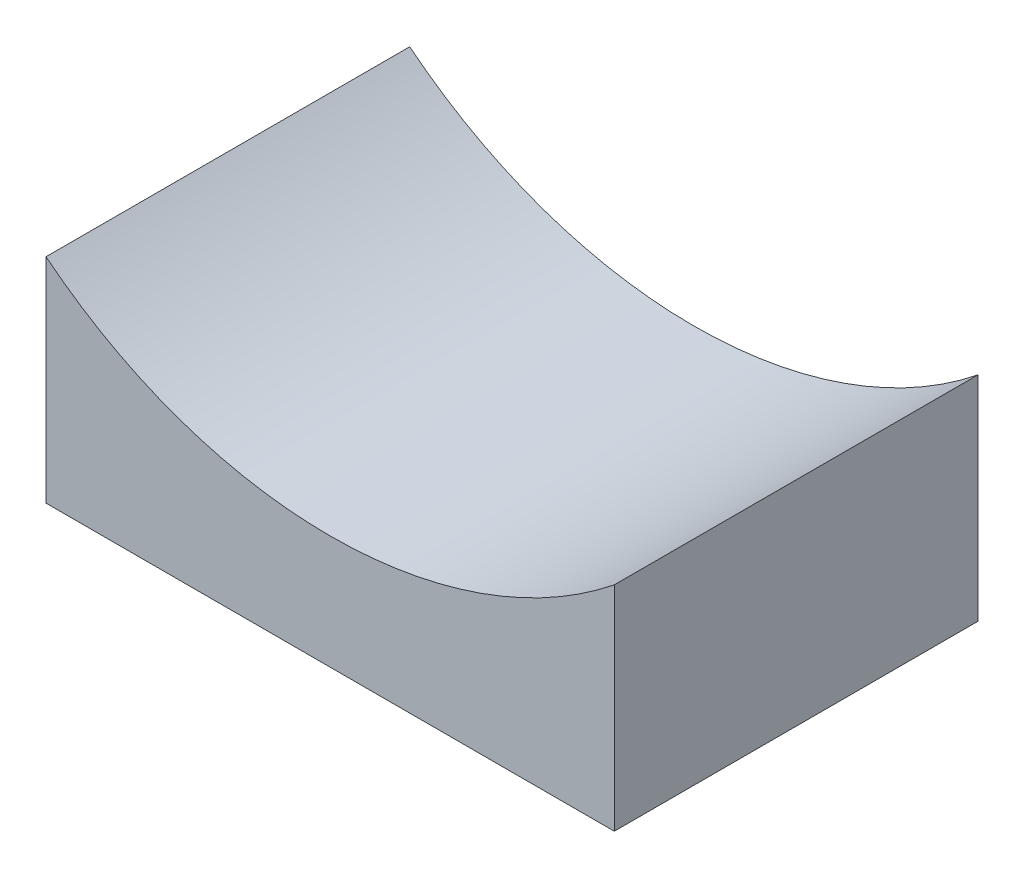
ISO-10303-21;
HEADER;
FILE_DESCRIPTION(('STEP AP214'),'2;1');
FILE_NAME('part.step','',(''),(''),'','','');
FILE_SCHEMA(('AUTOMOTIVE_DESIGN { 1 0 10303 214 1 1 1 1 }'));
ENDSEC;
DATA;
#1=APPLICATION_CONTEXT('core data for automotive mechanical design processes');
#2=APPLICATION_PROTOCOL_DEFINITION('international standard','automotive_design',2000,#1);
#3=PRODUCT_CONTEXT('',#1,'mechanical');
#4=PRODUCT('Part','Part','',(#3));
#5=PRODUCT_RELATED_PRODUCT_CATEGORY('part','',(#4));
#6=PRODUCT_DEFINITION_FORMATION('','',#4);
#7=PRODUCT_DEFINITION_CONTEXT('part definition',#1,'design');
#8=PRODUCT_DEFINITION('design','',#6,#7);
#9=PRODUCT_DEFINITION_SHAPE('','',#8);
#10=(LENGTH_UNIT() NAMED_UNIT(*) SI_UNIT(.MILLI.,.METRE.));
#11=(NAMED_UNIT(*) PLANE_ANGLE_UNIT() SI_UNIT($,.RADIAN.));
#12=(NAMED_UNIT(*) SI_UNIT($,.STERADIAN.) SOLID_ANGLE_UNIT());
#13=UNCERTAINTY_MEASURE_WITH_UNIT(LENGTH_MEASURE(1.E-05),#10,'distance_accuracy_value','');
#14=(GEOMETRIC_REPRESENTATION_CONTEXT(3) GLOBAL_UNCERTAINTY_ASSIGNED_CONTEXT((#13)) GLOBAL_UNIT_ASSIGNED_CONTEXT((#10,
#11,#12)) REPRESENTATION_CONTEXT('',''));
#15=CARTESIAN_POINT('',(0.,0.,0.));
#16=DIRECTION('',(0.,0.,1.));
#17=DIRECTION('',(1.,0.,0.));
#18=AXIS2_PLACEMENT_3D('',#15,#16,#17);
#19=CARTESIAN_POINT('',(0.,80.,0.));
#20=DIRECTION('',(1.,0.,0.));
#21=DIRECTION('',(0.,0.,-1.));
#22=AXIS2_PLACEMENT_3D('',#19,#20,#21);
#23=PLANE('',#22);
#24=DIRECTION('',(0.,-1.,0.));
#25=VECTOR('',#24,1.);
#26=CARTESIAN_POINT('',(0.,80.,0.));
#27=LINE('',#26,#25);
#28=CARTESIAN_POINT('',(0.,37.550020016016,0.));
#29=VERTEX_POINT('',#28);
#30=CARTESIAN_POINT('',(0.,0.,0.));
#31=VERTEX_POINT('',#30);
#32=EDGE_CURVE('E11',#29,#31,#27,.T.);
#33=ORIENTED_EDGE('',*,*,#32,.F.);
#34=DIRECTION('',(0.,0.,1.));
#35=VECTOR('',#34,1.);
#36=CARTESIAN_POINT('',(0.,37.550020016016,-64.));
#37=LINE('',#36,#35);
#38=CARTESIAN_POINT('',(0.,37.550020016016,-64.));
#39=VERTEX_POINT('',#38);
#40=EDGE_CURVE('E77',#29,#39,#37,.F.);
#41=ORIENTED_EDGE('',*,*,#40,.T.);
#42=DIRECTION('',(0.,-1.,0.));
#43=VECTOR('',#42,1.);
#44=CARTESIAN_POINT('',(0.,80.,-64.));
#45=LINE('',#44,#43);
#46=CARTESIAN_POINT('',(0.,0.,-64.));
#47=VERTEX_POINT('',#46);
#48=EDGE_CURVE('E61',#39,#47,#45,.T.);
#49=ORIENTED_EDGE('',*,*,#48,.T.);
#50=DIRECTION('',(0.,0.,1.));
#51=VECTOR('',#50,1.);
#52=CARTESIAN_POINT('',(0.,0.,0.));
#53=LINE('',#52,#51);
#54=EDGE_CURVE('E83',#47,#31,#53,.T.);
#55=ORIENTED_EDGE('',*,*,#54,.T.);
#56=EDGE_LOOP('',(#33,#41,#49,#55));
#57=FACE_BOUND('',#56,.T.);
#58=ADVANCED_FACE('F39',(#57),#23,.F.);
#59=CARTESIAN_POINT('',(0.,80.,0.));
#60=DIRECTION('',(0.,0.,-1.));
#61=DIRECTION('',(-1.,0.,0.));
#62=AXIS2_PLACEMENT_3D('',#59,#60,#61);
#63=PLANE('',#62);
#64=DIRECTION('',(0.,-1.,0.));
#65=VECTOR('',#64,1.);
#66=CARTESIAN_POINT('',(100.,80.,0.));
#67=LINE('',#66,#65);
#68=CARTESIAN_POINT('',(100.,37.550020016016,0.));
#69=VERTEX_POINT('',#68);
#70=CARTESIAN_POINT('',(100.,0.,0.));
#71=VERTEX_POINT('',#70);
#72=EDGE_CURVE('E46',#69,#71,#67,.T.);
#73=ORIENTED_EDGE('',*,*,#72,.F.);
#74=CARTESIAN_POINT('',(50.,100.,0.));
#75=DIRECTION('',(0.,0.,1.));
#76=DIRECTION('',(1.,0.,0.));
#77=AXIS2_PLACEMENT_3D('',#74,#75,#76);
#78=CIRCLE('',#77,80.);
#79=EDGE_CURVE('E80',#29,#69,#78,.T.);
#80=ORIENTED_EDGE('',*,*,#79,.F.);
#81=ORIENTED_EDGE('',*,*,#32,.T.);
#82=DIRECTION('',(1.,0.,0.));
#83=VECTOR('',#82,1.);
#84=CARTESIAN_POINT('',(0.,0.,0.));
#85=LINE('',#84,#83);
#86=EDGE_CURVE('E94',#31,#71,#85,.T.);
#87=ORIENTED_EDGE('',*,*,#86,.T.);
#88=EDGE_LOOP('',(#73,#80,#81,#87));
#89=FACE_BOUND('',#88,.T.);
#90=ADVANCED_FACE('F87',(#89),#63,.F.);
#91=CARTESIAN_POINT('',(100.,80.,0.));
#92=DIRECTION('',(-1.,0.,0.));
#93=DIRECTION('',(0.,0.,1.));
#94=AXIS2_PLACEMENT_3D('',#91,#92,#93);
#95=PLANE('',#94);
#96=DIRECTION('',(0.,-1.,0.));
#97=VECTOR('',#96,1.);
#98=CARTESIAN_POINT('',(100.,80.,-64.));
#99=LINE('',#98,#97);
#100=CARTESIAN_POINT('',(100.,37.550020016016,-64.));
#101=VERTEX_POINT('',#100);
#102=CARTESIAN_POINT('',(100.,0.,-64.));
#103=VERTEX_POINT('',#102);
#104=EDGE_CURVE('E105',#101,#103,#99,.T.);
#105=ORIENTED_EDGE('',*,*,#104,.F.);
#106=DIRECTION('',(0.,0.,1.));
#107=VECTOR('',#106,1.);
#108=CARTESIAN_POINT('',(100.,37.550020016016,-64.));
#109=LINE('',#108,#107);
#110=EDGE_CURVE('E53',#101,#69,#109,.T.);
#111=ORIENTED_EDGE('',*,*,#110,.T.);
#112=ORIENTED_EDGE('',*,*,#72,.T.);
#113=DIRECTION('',(0.,0.,-1.));
#114=VECTOR('',#113,1.);
#115=CARTESIAN_POINT('',(100.,0.,0.));
#116=LINE('',#115,#114);
#117=EDGE_CURVE('E96',#71,#103,#116,.T.);
#118=ORIENTED_EDGE('',*,*,#117,.T.);
#119=EDGE_LOOP('',(#105,#111,#112,#118));
#120=FACE_BOUND('',#119,.T.);
#121=ADVANCED_FACE('F108',(#120),#95,.F.);
#122=CARTESIAN_POINT('',(0.,80.,-64.));
#123=DIRECTION('',(0.,0.,1.));
#124=DIRECTION('',(1.,0.,0.));
#125=AXIS2_PLACEMENT_3D('',#122,#123,#124);
#126=PLANE('',#125);
#127=ORIENTED_EDGE('',*,*,#48,.F.);
#128=CARTESIAN_POINT('',(50.,100.,-64.));
#129=DIRECTION('',(0.,0.,1.));
#130=DIRECTION('',(1.,0.,0.));
#131=AXIS2_PLACEMENT_3D('',#128,#129,#130);
#132=CIRCLE('',#131,80.);
#133=EDGE_CURVE('E81',#39,#101,#132,.T.);
#134=ORIENTED_EDGE('',*,*,#133,.T.);
#135=ORIENTED_EDGE('',*,*,#104,.T.);
#136=DIRECTION('',(-1.,0.,0.));
#137=VECTOR('',#136,1.);
#138=CARTESIAN_POINT('',(0.,0.,-64.));
#139=LINE('',#138,#137);
#140=EDGE_CURVE('E102',#103,#47,#139,.T.);
#141=ORIENTED_EDGE('',*,*,#140,.T.);
#142=EDGE_LOOP('',(#127,#134,#135,#141));
#143=FACE_BOUND('',#142,.T.);
#144=ADVANCED_FACE('F112',(#143),#126,.F.);
#145=CARTESIAN_POINT('',(0.,0.,0.));
#146=DIRECTION('',(0.,-1.,0.));
#147=DIRECTION('',(0.,0.,-1.));
#148=AXIS2_PLACEMENT_3D('',#145,#146,#147);
#149=PLANE('',#148);
#150=ORIENTED_EDGE('',*,*,#54,.F.);
#151=ORIENTED_EDGE('',*,*,#140,.F.);
#152=ORIENTED_EDGE('',*,*,#117,.F.);
#153=ORIENTED_EDGE('',*,*,#86,.F.);
#154=EDGE_LOOP('',(#150,#151,#152,#153));
#155=FACE_BOUND('',#154,.T.);
#156=ADVANCED_FACE('F110',(#155),#149,.T.);
#157=CARTESIAN_POINT('',(50.,100.,-64.));
#158=DIRECTION('',(0.,0.,1.));
#159=DIRECTION('',(1.,0.,0.));
#160=AXIS2_PLACEMENT_3D('',#157,#158,#159);
#161=CYLINDRICAL_SURFACE('',#160,80.);
#162=ORIENTED_EDGE('',*,*,#79,.T.);
#163=ORIENTED_EDGE('',*,*,#110,.F.);
#164=ORIENTED_EDGE('',*,*,#133,.F.);
#165=ORIENTED_EDGE('',*,*,#40,.F.);
#166=EDGE_LOOP('',(#162,#163,#164,#165));
#167=FACE_BOUND('',#166,.T.);
#168=ADVANCED_FACE('F79',(#167),#161,.F.);
#169=CLOSED_SHELL('',(#58,#90,#121,#144,#156,#168));
#170=MANIFOLD_SOLID_BREP('B2',#169);
#171=ADVANCED_BREP_SHAPE_REPRESENTATION('',(#18,#170),#14);
#172=SHAPE_DEFINITION_REPRESENTATION(#9,#171);
ENDSEC;
END-ISO-10303-21;
